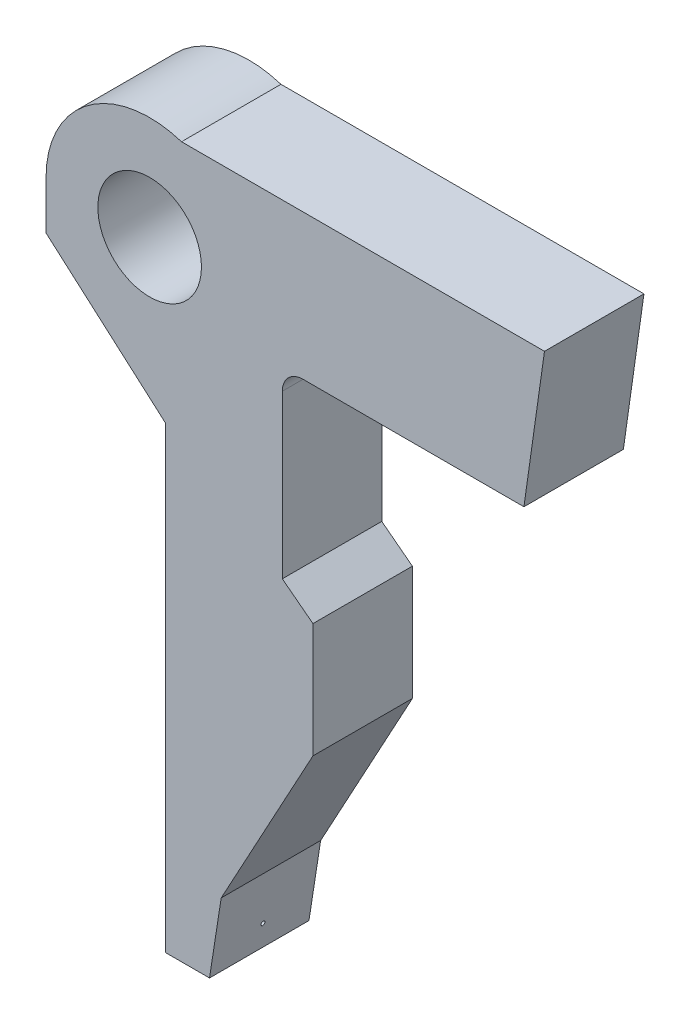
ISO-10303-21;
HEADER;
FILE_DESCRIPTION(('STEP AP214'),'2;1');
FILE_NAME('part.step','',(''),(''),'','','');
FILE_SCHEMA(('AUTOMOTIVE_DESIGN { 1 0 10303 214 1 1 1 1 }'));
ENDSEC;
DATA;
#1=APPLICATION_CONTEXT('core data for automotive mechanical design processes');
#2=APPLICATION_PROTOCOL_DEFINITION('international standard','automotive_design',2000,#1);
#3=PRODUCT_CONTEXT('',#1,'mechanical');
#4=PRODUCT('Part','Part','',(#3));
#5=PRODUCT_RELATED_PRODUCT_CATEGORY('part','',(#4));
#6=PRODUCT_DEFINITION_FORMATION('','',#4);
#7=PRODUCT_DEFINITION_CONTEXT('part definition',#1,'design');
#8=PRODUCT_DEFINITION('design','',#6,#7);
#9=PRODUCT_DEFINITION_SHAPE('','',#8);
#10=(LENGTH_UNIT() NAMED_UNIT(*) SI_UNIT(.MILLI.,.METRE.));
#11=(NAMED_UNIT(*) PLANE_ANGLE_UNIT() SI_UNIT($,.RADIAN.));
#12=(NAMED_UNIT(*) SI_UNIT($,.STERADIAN.) SOLID_ANGLE_UNIT());
#13=UNCERTAINTY_MEASURE_WITH_UNIT(LENGTH_MEASURE(1.E-05),#10,'distance_accuracy_value','');
#14=(GEOMETRIC_REPRESENTATION_CONTEXT(3) GLOBAL_UNCERTAINTY_ASSIGNED_CONTEXT((#13)) GLOBAL_UNIT_ASSIGNED_CONTEXT((#10,
#11,#12)) REPRESENTATION_CONTEXT('',''));
#15=CARTESIAN_POINT('',(0.,0.,0.));
#16=DIRECTION('',(0.,0.,1.));
#17=DIRECTION('',(1.,0.,0.));
#18=AXIS2_PLACEMENT_3D('',#15,#16,#17);
#19=CARTESIAN_POINT('',(6.40208237027269,0.,4.8));
#20=DIRECTION('',(-1.,0.,0.));
#21=DIRECTION('',(0.,-1.,0.));
#22=AXIS2_PLACEMENT_3D('',#19,#20,#21);
#23=PLANE('',#22);
#24=DIRECTION('',(0.,1.,0.));
#25=VECTOR('',#24,1.);
#26=CARTESIAN_POINT('',(6.40208237027269,0.,0.));
#27=LINE('',#26,#25);
#28=CARTESIAN_POINT('',(6.40208237027269,-11.0792552576076,0.));
#29=VERTEX_POINT('',#28);
#30=CARTESIAN_POINT('',(6.40208237027269,-3.2376102121532,0.));
#31=VERTEX_POINT('',#30);
#32=EDGE_CURVE('E170',#29,#31,#27,.T.);
#33=ORIENTED_EDGE('',*,*,#32,.T.);
#34=DIRECTION('',(0.,0.,-1.));
#35=VECTOR('',#34,1.);
#36=CARTESIAN_POINT('',(6.40208237027269,-3.2376102121532,4.8));
#37=LINE('',#36,#35);
#38=CARTESIAN_POINT('',(6.40208237027269,-3.2376102121532,4.8));
#39=VERTEX_POINT('',#38);
#40=EDGE_CURVE('E11',#39,#31,#37,.T.);
#41=ORIENTED_EDGE('',*,*,#40,.F.);
#42=DIRECTION('',(0.,1.,0.));
#43=VECTOR('',#42,1.);
#44=CARTESIAN_POINT('',(6.40208237027269,0.,4.8));
#45=LINE('',#44,#43);
#46=CARTESIAN_POINT('',(6.40208237027269,-11.0792552576076,4.8));
#47=VERTEX_POINT('',#46);
#48=EDGE_CURVE('E200',#47,#39,#45,.T.);
#49=ORIENTED_EDGE('',*,*,#48,.F.);
#50=DIRECTION('',(0.,0.,-1.));
#51=VECTOR('',#50,1.);
#52=CARTESIAN_POINT('',(6.40208237027269,-11.0792552576076,4.8));
#53=LINE('',#52,#51);
#54=EDGE_CURVE('E169',#47,#29,#53,.T.);
#55=ORIENTED_EDGE('',*,*,#54,.T.);
#56=EDGE_LOOP('',(#33,#41,#49,#55));
#57=FACE_BOUND('',#56,.T.);
#58=ADVANCED_FACE('F34',(#57),#23,.F.);
#59=CARTESIAN_POINT('',(7.40208237027269,-3.2376102121532,4.8));
#60=DIRECTION('',(0.,0.,-1.));
#61=DIRECTION('',(-1.,0.,0.));
#62=AXIS2_PLACEMENT_3D('',#59,#60,#61);
#63=CYLINDRICAL_SURFACE('',#62,0.999999999999999);
#64=CARTESIAN_POINT('',(7.40208237027269,-3.2376102121532,0.));
#65=DIRECTION('',(0.,0.,1.));
#66=DIRECTION('',(1.,0.,0.));
#67=AXIS2_PLACEMENT_3D('',#64,#65,#66);
#68=CIRCLE('',#67,0.999999999999999);
#69=CARTESIAN_POINT('',(7.40208237027269,-2.2376102121532,0.));
#70=VERTEX_POINT('',#69);
#71=EDGE_CURVE('E173',#31,#70,#68,.F.);
#72=ORIENTED_EDGE('',*,*,#71,.T.);
#73=DIRECTION('',(0.,0.,-1.));
#74=VECTOR('',#73,1.);
#75=CARTESIAN_POINT('',(7.40208237027269,-2.2376102121532,4.8));
#76=LINE('',#75,#74);
#77=CARTESIAN_POINT('',(7.40208237027269,-2.2376102121532,4.8));
#78=VERTEX_POINT('',#77);
#79=EDGE_CURVE('E42',#78,#70,#76,.T.);
#80=ORIENTED_EDGE('',*,*,#79,.F.);
#81=CARTESIAN_POINT('',(7.40208237027269,-3.2376102121532,4.8));
#82=DIRECTION('',(0.,0.,1.));
#83=DIRECTION('',(1.,0.,0.));
#84=AXIS2_PLACEMENT_3D('',#81,#82,#83);
#85=CIRCLE('',#84,0.999999999999999);
#86=EDGE_CURVE('E111',#39,#78,#85,.F.);
#87=ORIENTED_EDGE('',*,*,#86,.F.);
#88=ORIENTED_EDGE('',*,*,#40,.T.);
#89=EDGE_LOOP('',(#72,#80,#87,#88));
#90=FACE_BOUND('',#89,.T.);
#91=ADVANCED_FACE('F290',(#90),#63,.F.);
#92=CARTESIAN_POINT('',(0.,-2.2376102121532,4.8));
#93=DIRECTION('',(0.,1.,0.));
#94=DIRECTION('',(-1.,0.,0.));
#95=AXIS2_PLACEMENT_3D('',#92,#93,#94);
#96=PLANE('',#95);
#97=DIRECTION('',(1.,0.,0.));
#98=VECTOR('',#97,1.);
#99=CARTESIAN_POINT('',(0.,-2.2376102121532,0.));
#100=LINE('',#99,#98);
#101=CARTESIAN_POINT('',(18.063612226188,-2.2376102121532,0.));
#102=VERTEX_POINT('',#101);
#103=EDGE_CURVE('E176',#70,#102,#100,.T.);
#104=ORIENTED_EDGE('',*,*,#103,.T.);
#105=DIRECTION('',(0.,0.,-1.));
#106=VECTOR('',#105,1.);
#107=CARTESIAN_POINT('',(18.063612226188,-2.2376102121532,4.8));
#108=LINE('',#107,#106);
#109=CARTESIAN_POINT('',(18.063612226188,-2.2376102121532,4.8));
#110=VERTEX_POINT('',#109);
#111=EDGE_CURVE('E225',#110,#102,#108,.T.);
#112=ORIENTED_EDGE('',*,*,#111,.F.);
#113=DIRECTION('',(1.,0.,0.));
#114=VECTOR('',#113,1.);
#115=CARTESIAN_POINT('',(0.,-2.2376102121532,4.8));
#116=LINE('',#115,#114);
#117=EDGE_CURVE('E233',#78,#110,#116,.T.);
#118=ORIENTED_EDGE('',*,*,#117,.F.);
#119=ORIENTED_EDGE('',*,*,#79,.T.);
#120=EDGE_LOOP('',(#104,#112,#118,#119));
#121=FACE_BOUND('',#120,.T.);
#122=ADVANCED_FACE('F231',(#121),#96,.F.);
#123=CARTESIAN_POINT('',(18.0184346235268,-2.55607840833381,4.8));
#124=DIRECTION('',(-0.990087364863809,0.140452874434947,0.));
#125=DIRECTION('',(-0.140452874434947,-0.990087364863809,0.));
#126=AXIS2_PLACEMENT_3D('',#123,#124,#125);
#127=PLANE('',#126);
#128=DIRECTION('',(0.140452874434947,0.990087364863809,0.));
#129=VECTOR('',#128,1.);
#130=CARTESIAN_POINT('',(18.0184346235268,-2.55607840833381,0.));
#131=LINE('',#130,#129);
#132=CARTESIAN_POINT('',(19.0560025989645,4.7579971974597,0.));
#133=VERTEX_POINT('',#132);
#134=EDGE_CURVE('E178',#102,#133,#131,.T.);
#135=ORIENTED_EDGE('',*,*,#134,.T.);
#136=DIRECTION('',(0.,0.,-1.));
#137=VECTOR('',#136,1.);
#138=CARTESIAN_POINT('',(19.0560025989645,4.7579971974597,4.8));
#139=LINE('',#138,#137);
#140=CARTESIAN_POINT('',(19.0560025989645,4.7579971974597,4.8));
#141=VERTEX_POINT('',#140);
#142=EDGE_CURVE('E222',#141,#133,#139,.T.);
#143=ORIENTED_EDGE('',*,*,#142,.F.);
#144=DIRECTION('',(0.140452874434947,0.990087364863809,0.));
#145=VECTOR('',#144,1.);
#146=CARTESIAN_POINT('',(18.0184346235268,-2.55607840833381,4.8));
#147=LINE('',#146,#145);
#148=EDGE_CURVE('E252',#110,#141,#147,.T.);
#149=ORIENTED_EDGE('',*,*,#148,.F.);
#150=ORIENTED_EDGE('',*,*,#111,.T.);
#151=EDGE_LOOP('',(#135,#143,#149,#150));
#152=FACE_BOUND('',#151,.T.);
#153=ADVANCED_FACE('F243',(#152),#127,.F.);
#154=CARTESIAN_POINT('',(0.,4.7579971974597,4.8));
#155=DIRECTION('',(0.,-1.,0.));
#156=DIRECTION('',(0.,0.,-1.));
#157=AXIS2_PLACEMENT_3D('',#154,#155,#156);
#158=PLANE('',#157);
#159=DIRECTION('',(-1.,0.,0.));
#160=VECTOR('',#159,1.);
#161=CARTESIAN_POINT('',(0.,4.7579971974597,0.));
#162=LINE('',#161,#160);
#163=CARTESIAN_POINT('',(1.53670513403374,4.7579971974597,0.));
#164=VERTEX_POINT('',#163);
#165=EDGE_CURVE('E180',#133,#164,#162,.T.);
#166=ORIENTED_EDGE('',*,*,#165,.T.);
#167=DIRECTION('',(0.,0.,-1.));
#168=VECTOR('',#167,1.);
#169=CARTESIAN_POINT('',(1.53670513403374,4.7579971974597,4.8));
#170=LINE('',#169,#168);
#171=CARTESIAN_POINT('',(1.53670513403374,4.7579971974597,4.8));
#172=VERTEX_POINT('',#171);
#173=EDGE_CURVE('E219',#172,#164,#170,.T.);
#174=ORIENTED_EDGE('',*,*,#173,.F.);
#175=DIRECTION('',(-1.,0.,0.));
#176=VECTOR('',#175,1.);
#177=CARTESIAN_POINT('',(0.,4.7579971974597,4.8));
#178=LINE('',#177,#176);
#179=EDGE_CURVE('E249',#141,#172,#178,.T.);
#180=ORIENTED_EDGE('',*,*,#179,.F.);
#181=ORIENTED_EDGE('',*,*,#142,.T.);
#182=EDGE_LOOP('',(#166,#174,#180,#181));
#183=FACE_BOUND('',#182,.T.);
#184=ADVANCED_FACE('F247',(#183),#158,.F.);
#185=CARTESIAN_POINT('',(0.,0.,4.8));
#186=DIRECTION('',(0.,0.,-1.));
#187=DIRECTION('',(-1.,0.,0.));
#188=AXIS2_PLACEMENT_3D('',#185,#186,#187);
#189=CYLINDRICAL_SURFACE('',#188,5.);
#190=CARTESIAN_POINT('',(0.,0.,0.));
#191=DIRECTION('',(0.,0.,1.));
#192=DIRECTION('',(1.,0.,0.));
#193=AXIS2_PLACEMENT_3D('',#190,#191,#192);
#194=CIRCLE('',#193,5.);
#195=CARTESIAN_POINT('',(-5.,0.,0.));
#196=VERTEX_POINT('',#195);
#197=EDGE_CURVE('E182',#164,#196,#194,.T.);
#198=ORIENTED_EDGE('',*,*,#197,.T.);
#199=DIRECTION('',(0.,0.,-1.));
#200=VECTOR('',#199,1.);
#201=CARTESIAN_POINT('',(-5.,0.,4.8));
#202=LINE('',#201,#200);
#203=CARTESIAN_POINT('',(-5.,0.,4.8));
#204=VERTEX_POINT('',#203);
#205=EDGE_CURVE('E216',#204,#196,#202,.T.);
#206=ORIENTED_EDGE('',*,*,#205,.F.);
#207=CARTESIAN_POINT('',(0.,0.,4.8));
#208=DIRECTION('',(0.,0.,1.));
#209=DIRECTION('',(1.,0.,0.));
#210=AXIS2_PLACEMENT_3D('',#207,#208,#209);
#211=CIRCLE('',#210,5.);
#212=EDGE_CURVE('E251',#172,#204,#211,.T.);
#213=ORIENTED_EDGE('',*,*,#212,.F.);
#214=ORIENTED_EDGE('',*,*,#173,.T.);
#215=EDGE_LOOP('',(#198,#206,#213,#214));
#216=FACE_BOUND('',#215,.T.);
#217=ADVANCED_FACE('F303',(#216),#189,.T.);
#218=CARTESIAN_POINT('',(-5.,0.,4.8));
#219=DIRECTION('',(1.,0.,0.));
#220=DIRECTION('',(0.,0.,-1.));
#221=AXIS2_PLACEMENT_3D('',#218,#219,#220);
#222=PLANE('',#221);
#223=DIRECTION('',(0.,-1.,0.));
#224=VECTOR('',#223,1.);
#225=CARTESIAN_POINT('',(-5.,0.,0.));
#226=LINE('',#225,#224);
#227=CARTESIAN_POINT('',(-5.,-2.32647439688253,0.));
#228=VERTEX_POINT('',#227);
#229=EDGE_CURVE('E184',#196,#228,#226,.T.);
#230=ORIENTED_EDGE('',*,*,#229,.T.);
#231=DIRECTION('',(0.,0.,-1.));
#232=VECTOR('',#231,1.);
#233=CARTESIAN_POINT('',(-5.,-2.32647439688253,4.8));
#234=LINE('',#233,#232);
#235=CARTESIAN_POINT('',(-5.,-2.32647439688253,4.8));
#236=VERTEX_POINT('',#235);
#237=EDGE_CURVE('E213',#236,#228,#234,.T.);
#238=ORIENTED_EDGE('',*,*,#237,.F.);
#239=DIRECTION('',(0.,-1.,0.));
#240=VECTOR('',#239,1.);
#241=CARTESIAN_POINT('',(-5.,0.,4.8));
#242=LINE('',#241,#240);
#243=EDGE_CURVE('E254',#204,#236,#242,.T.);
#244=ORIENTED_EDGE('',*,*,#243,.F.);
#245=ORIENTED_EDGE('',*,*,#205,.T.);
#246=EDGE_LOOP('',(#230,#238,#244,#245));
#247=FACE_BOUND('',#246,.T.);
#248=ADVANCED_FACE('F306',(#247),#222,.F.);
#249=CARTESIAN_POINT('',(-3.32960365921922,-3.79285286398016,4.8));
#250=DIRECTION('',(0.659722162079872,0.751509593325767,0.));
#251=DIRECTION('',(-0.751509593325767,0.659722162079872,0.));
#252=AXIS2_PLACEMENT_3D('',#249,#250,#251);
#253=PLANE('',#252);
#254=DIRECTION('',(0.751509593325767,-0.659722162079872,0.));
#255=VECTOR('',#254,1.);
#256=CARTESIAN_POINT('',(-3.32960365921922,-3.79285286398016,0.));
#257=LINE('',#256,#255);
#258=CARTESIAN_POINT('',(0.754164722411706,-7.3778403745722,0.));
#259=VERTEX_POINT('',#258);
#260=EDGE_CURVE('E186',#228,#259,#257,.T.);
#261=ORIENTED_EDGE('',*,*,#260,.T.);
#262=DIRECTION('',(0.,0.,-1.));
#263=VECTOR('',#262,1.);
#264=CARTESIAN_POINT('',(0.754164722411706,-7.3778403745722,4.8));
#265=LINE('',#264,#263);
#266=CARTESIAN_POINT('',(0.754164722411706,-7.3778403745722,4.8));
#267=VERTEX_POINT('',#266);
#268=EDGE_CURVE('E210',#267,#259,#265,.T.);
#269=ORIENTED_EDGE('',*,*,#268,.F.);
#270=DIRECTION('',(0.751509593325767,-0.659722162079872,0.));
#271=VECTOR('',#270,1.);
#272=CARTESIAN_POINT('',(-3.32960365921922,-3.79285286398016,4.8));
#273=LINE('',#272,#271);
#274=EDGE_CURVE('E260',#236,#267,#273,.T.);
#275=ORIENTED_EDGE('',*,*,#274,.F.);
#276=ORIENTED_EDGE('',*,*,#237,.T.);
#277=EDGE_LOOP('',(#261,#269,#275,#276));
#278=FACE_BOUND('',#277,.T.);
#279=ADVANCED_FACE('F310',(#278),#253,.F.);
#280=CARTESIAN_POINT('',(0.754164722411706,0.,4.8));
#281=DIRECTION('',(1.,0.,0.));
#282=DIRECTION('',(0.,0.,-1.));
#283=AXIS2_PLACEMENT_3D('',#280,#281,#282);
#284=PLANE('',#283);
#285=CARTESIAN_POINT('',(0.754164722411706,-27.0198901160511,2.4));
#286=DIRECTION('',(-1.,0.,0.));
#287=DIRECTION('',(0.,0.,1.));
#288=AXIS2_PLACEMENT_3D('',#285,#286,#287);
#289=CIRCLE('',#288,1.825);
#290=CARTESIAN_POINT('',(0.754164722411706,-27.0198901160511,4.225));
#291=VERTEX_POINT('',#290);
#292=EDGE_CURVE('E415',#291,#291,#289,.T.);
#293=ORIENTED_EDGE('',*,*,#292,.F.);
#294=EDGE_LOOP('',(#293));
#295=FACE_BOUND('',#294,.T.);
#296=DIRECTION('',(0.,-1.,0.));
#297=VECTOR('',#296,1.);
#298=CARTESIAN_POINT('',(0.754164722411706,0.,0.));
#299=LINE('',#298,#297);
#300=CARTESIAN_POINT('',(0.754164722411706,-29.5198901160511,0.));
#301=VERTEX_POINT('',#300);
#302=EDGE_CURVE('E188',#259,#301,#299,.T.);
#303=ORIENTED_EDGE('',*,*,#302,.T.);
#304=DIRECTION('',(0.,0.,-1.));
#305=VECTOR('',#304,1.);
#306=CARTESIAN_POINT('',(0.754164722411706,-29.5198901160511,4.8));
#307=LINE('',#306,#305);
#308=CARTESIAN_POINT('',(0.754164722411706,-29.5198901160511,4.8));
#309=VERTEX_POINT('',#308);
#310=EDGE_CURVE('E207',#309,#301,#307,.T.);
#311=ORIENTED_EDGE('',*,*,#310,.F.);
#312=DIRECTION('',(0.,-1.,0.));
#313=VECTOR('',#312,1.);
#314=CARTESIAN_POINT('',(0.754164722411706,0.,4.8));
#315=LINE('',#314,#313);
#316=EDGE_CURVE('E262',#267,#309,#315,.T.);
#317=ORIENTED_EDGE('',*,*,#316,.F.);
#318=ORIENTED_EDGE('',*,*,#268,.T.);
#319=EDGE_LOOP('',(#303,#311,#317,#318));
#320=FACE_BOUND('',#319,.T.);
#321=ADVANCED_FACE('F314',(#295,#320),#284,.F.);
#322=CARTESIAN_POINT('',(-2.39866646747301E-13,-29.519890116051,4.8));
#323=DIRECTION('',(0.,1.,0.));
#324=DIRECTION('',(-1.,0.,0.));
#325=AXIS2_PLACEMENT_3D('',#322,#323,#324);
#326=PLANE('',#325);
#327=DIRECTION('',(1.,0.,0.));
#328=VECTOR('',#327,1.);
#329=CARTESIAN_POINT('',(-2.39866646747301E-13,-29.519890116051,0.));
#330=LINE('',#329,#328);
#331=CARTESIAN_POINT('',(2.88905288160283,-29.5198901160511,0.));
#332=VERTEX_POINT('',#331);
#333=EDGE_CURVE('E190',#301,#332,#330,.T.);
#334=ORIENTED_EDGE('',*,*,#333,.T.);
#335=DIRECTION('',(0.,0.,-1.));
#336=VECTOR('',#335,1.);
#337=CARTESIAN_POINT('',(2.88905288160283,-29.5198901160511,4.8));
#338=LINE('',#337,#336);
#339=CARTESIAN_POINT('',(2.88905288160283,-29.5198901160511,4.8));
#340=VERTEX_POINT('',#339);
#341=EDGE_CURVE('E204',#340,#332,#338,.T.);
#342=ORIENTED_EDGE('',*,*,#341,.F.);
#343=DIRECTION('',(1.,0.,0.));
#344=VECTOR('',#343,1.);
#345=CARTESIAN_POINT('',(-2.39866646747301E-13,-29.519890116051,4.8));
#346=LINE('',#345,#344);
#347=EDGE_CURVE('E264',#309,#340,#346,.T.);
#348=ORIENTED_EDGE('',*,*,#347,.F.);
#349=ORIENTED_EDGE('',*,*,#310,.T.);
#350=EDGE_LOOP('',(#334,#342,#348,#349));
#351=FACE_BOUND('',#350,.T.);
#352=ADVANCED_FACE('F270',(#351),#326,.F.);
#353=CARTESIAN_POINT('',(7.29737212162931,-1.13324948681235,4.8));
#354=DIRECTION('',(-0.988155457698499,0.153456154717463,0.));
#355=DIRECTION('',(-0.153456154717463,-0.988155457698499,0.));
#356=AXIS2_PLACEMENT_3D('',#353,#354,#355);
#357=PLANE('',#356);
#358=CARTESIAN_POINT('',(3.07152516406432,-28.3448901160511,2.4));
#359=DIRECTION('',(-0.988155457698499,0.153456154717463,0.));
#360=DIRECTION('',(-0.153456154717463,-0.988155457698499,0.));
#361=AXIS2_PLACEMENT_3D('',#358,#359,#360);
#362=ELLIPSE('',#361,0.101198651711046,0.0999999999999997);
#363=CARTESIAN_POINT('',(3.05599560811015,-28.4448901160511,2.4));
#364=VERTEX_POINT('',#363);
#365=EDGE_CURVE('E414',#364,#364,#362,.F.);
#366=ORIENTED_EDGE('',*,*,#365,.F.);
#367=EDGE_LOOP('',(#366));
#368=FACE_BOUND('',#367,.T.);
#369=DIRECTION('',(0.153456154717463,0.988155457698499,0.));
#370=VECTOR('',#369,1.);
#371=CARTESIAN_POINT('',(7.29737212162931,-1.13324948681235,0.));
#372=LINE('',#371,#370);
#373=CARTESIAN_POINT('',(3.45262694445621,-25.8908484067027,0.));
#374=VERTEX_POINT('',#373);
#375=EDGE_CURVE('E192',#332,#374,#372,.T.);
#376=ORIENTED_EDGE('',*,*,#375,.T.);
#377=DIRECTION('',(0.,0.,-1.));
#378=VECTOR('',#377,1.);
#379=CARTESIAN_POINT('',(3.45262694445621,-25.8908484067027,4.8));
#380=LINE('',#379,#378);
#381=CARTESIAN_POINT('',(3.45262694445621,-25.8908484067027,4.8));
#382=VERTEX_POINT('',#381);
#383=EDGE_CURVE('E158',#382,#374,#380,.T.);
#384=ORIENTED_EDGE('',*,*,#383,.F.);
#385=DIRECTION('',(0.153456154717463,0.988155457698499,0.));
#386=VECTOR('',#385,1.);
#387=CARTESIAN_POINT('',(7.29737212162931,-1.13324948681235,4.8));
#388=LINE('',#387,#386);
#389=EDGE_CURVE('E149',#340,#382,#388,.T.);
#390=ORIENTED_EDGE('',*,*,#389,.F.);
#391=ORIENTED_EDGE('',*,*,#341,.T.);
#392=EDGE_LOOP('',(#376,#384,#390,#391));
#393=FACE_BOUND('',#392,.T.);
#394=ADVANCED_FACE('F274',(#368,#393),#357,.F.);
#395=CARTESIAN_POINT('',(13.5263332156528,-7.34866620752027,4.8));
#396=DIRECTION('',(-0.878695413301182,0.477382834466704,0.));
#397=DIRECTION('',(-0.477382834466704,-0.878695413301182,0.));
#398=AXIS2_PLACEMENT_3D('',#395,#396,#397);
#399=PLANE('',#398);
#400=DIRECTION('',(0.477382834466704,0.878695413301182,0.));
#401=VECTOR('',#400,1.);
#402=CARTESIAN_POINT('',(13.5263332156528,-7.34866620752027,0.));
#403=LINE('',#402,#401);
#404=CARTESIAN_POINT('',(7.88035743742888,-17.7409397912093,0.));
#405=VERTEX_POINT('',#404);
#406=EDGE_CURVE('E157',#374,#405,#403,.T.);
#407=ORIENTED_EDGE('',*,*,#406,.T.);
#408=DIRECTION('',(0.,0.,-1.));
#409=VECTOR('',#408,1.);
#410=CARTESIAN_POINT('',(7.88035743742888,-17.7409397912093,4.8));
#411=LINE('',#410,#409);
#412=CARTESIAN_POINT('',(7.88035743742888,-17.7409397912093,4.8));
#413=VERTEX_POINT('',#412);
#414=EDGE_CURVE('E154',#413,#405,#411,.T.);
#415=ORIENTED_EDGE('',*,*,#414,.F.);
#416=DIRECTION('',(0.477382834466704,0.878695413301182,0.));
#417=VECTOR('',#416,1.);
#418=CARTESIAN_POINT('',(13.5263332156528,-7.34866620752027,4.8));
#419=LINE('',#418,#417);
#420=EDGE_CURVE('E142',#382,#413,#419,.T.);
#421=ORIENTED_EDGE('',*,*,#420,.F.);
#422=ORIENTED_EDGE('',*,*,#383,.T.);
#423=EDGE_LOOP('',(#407,#415,#421,#422));
#424=FACE_BOUND('',#423,.T.);
#425=ADVANCED_FACE('F155',(#424),#399,.F.);
#426=CARTESIAN_POINT('',(7.88035743742888,0.,4.8));
#427=DIRECTION('',(-1.,0.,0.));
#428=DIRECTION('',(0.,0.,1.));
#429=AXIS2_PLACEMENT_3D('',#426,#427,#428);
#430=PLANE('',#429);
#431=DIRECTION('',(0.,1.,0.));
#432=VECTOR('',#431,1.);
#433=CARTESIAN_POINT('',(7.88035743742888,0.,0.));
#434=LINE('',#433,#432);
#435=CARTESIAN_POINT('',(7.88035743742888,-12.211059605899,0.));
#436=VERTEX_POINT('',#435);
#437=EDGE_CURVE('E97',#405,#436,#434,.T.);
#438=ORIENTED_EDGE('',*,*,#437,.T.);
#439=DIRECTION('',(0.,0.,-1.));
#440=VECTOR('',#439,1.);
#441=CARTESIAN_POINT('',(7.88035743742888,-12.211059605899,4.8));
#442=LINE('',#441,#440);
#443=CARTESIAN_POINT('',(7.88035743742888,-12.211059605899,4.8));
#444=VERTEX_POINT('',#443);
#445=EDGE_CURVE('E159',#444,#436,#442,.T.);
#446=ORIENTED_EDGE('',*,*,#445,.F.);
#447=DIRECTION('',(0.,1.,0.));
#448=VECTOR('',#447,1.);
#449=CARTESIAN_POINT('',(7.88035743742888,0.,4.8));
#450=LINE('',#449,#448);
#451=EDGE_CURVE('E147',#413,#444,#450,.T.);
#452=ORIENTED_EDGE('',*,*,#451,.F.);
#453=ORIENTED_EDGE('',*,*,#414,.T.);
#454=EDGE_LOOP('',(#438,#446,#452,#453));
#455=FACE_BOUND('',#454,.T.);
#456=ADVANCED_FACE('F161',(#455),#430,.F.);
#457=CARTESIAN_POINT('',(-2.98186004568765,-3.89467434538796,4.8));
#458=DIRECTION('',(-0.607910502716912,-0.794005554569029,0.));
#459=DIRECTION('',(0.794005554569029,-0.607910502716912,0.));
#460=AXIS2_PLACEMENT_3D('',#457,#458,#459);
#461=PLANE('',#460);
#462=DIRECTION('',(-0.794005554569029,0.607910502716912,0.));
#463=VECTOR('',#462,1.);
#464=CARTESIAN_POINT('',(-2.98186004568765,-3.89467434538796,0.));
#465=LINE('',#464,#463);
#466=EDGE_CURVE('E103',#436,#29,#465,.T.);
#467=ORIENTED_EDGE('',*,*,#466,.T.);
#468=ORIENTED_EDGE('',*,*,#54,.F.);
#469=DIRECTION('',(-0.794005554569029,0.607910502716912,0.));
#470=VECTOR('',#469,1.);
#471=CARTESIAN_POINT('',(-2.98186004568765,-3.89467434538796,4.8));
#472=LINE('',#471,#470);
#473=EDGE_CURVE('E50',#444,#47,#472,.T.);
#474=ORIENTED_EDGE('',*,*,#473,.F.);
#475=ORIENTED_EDGE('',*,*,#445,.T.);
#476=EDGE_LOOP('',(#467,#468,#474,#475));
#477=FACE_BOUND('',#476,.T.);
#478=ADVANCED_FACE('F278',(#477),#461,.F.);
#479=CARTESIAN_POINT('',(0.,0.,4.8));
#480=DIRECTION('',(0.,0.,-1.));
#481=DIRECTION('',(-1.,0.,0.));
#482=AXIS2_PLACEMENT_3D('',#479,#480,#481);
#483=CYLINDRICAL_SURFACE('',#482,2.5);
#484=CARTESIAN_POINT('',(0.,0.,4.8));
#485=DIRECTION('',(0.,0.,1.));
#486=DIRECTION('',(1.,0.,0.));
#487=AXIS2_PLACEMENT_3D('',#484,#485,#486);
#488=CIRCLE('',#487,2.5);
#489=CARTESIAN_POINT('',(2.5,0.,4.8));
#490=VERTEX_POINT('',#489);
#491=EDGE_CURVE('E163',#490,#490,#488,.T.);
#492=ORIENTED_EDGE('',*,*,#491,.T.);
#493=EDGE_LOOP('',(#492));
#494=FACE_BOUND('',#493,.T.);
#495=CARTESIAN_POINT('',(0.,0.,0.));
#496=DIRECTION('',(0.,0.,1.));
#497=DIRECTION('',(1.,0.,0.));
#498=AXIS2_PLACEMENT_3D('',#495,#496,#497);
#499=CIRCLE('',#498,2.5);
#500=CARTESIAN_POINT('',(2.5,0.,0.));
#501=VERTEX_POINT('',#500);
#502=EDGE_CURVE('E197',#501,#501,#499,.T.);
#503=ORIENTED_EDGE('',*,*,#502,.F.);
#504=EDGE_LOOP('',(#503));
#505=FACE_BOUND('',#504,.T.);
#506=ADVANCED_FACE('F280',(#494,#505),#483,.F.);
#507=CARTESIAN_POINT('',(0.,0.,4.8));
#508=DIRECTION('',(0.,0.,1.));
#509=DIRECTION('',(1.,0.,0.));
#510=AXIS2_PLACEMENT_3D('',#507,#508,#509);
#511=PLANE('',#510);
#512=ORIENTED_EDGE('',*,*,#48,.T.);
#513=ORIENTED_EDGE('',*,*,#86,.T.);
#514=ORIENTED_EDGE('',*,*,#117,.T.);
#515=ORIENTED_EDGE('',*,*,#148,.T.);
#516=ORIENTED_EDGE('',*,*,#179,.T.);
#517=ORIENTED_EDGE('',*,*,#212,.T.);
#518=ORIENTED_EDGE('',*,*,#243,.T.);
#519=ORIENTED_EDGE('',*,*,#274,.T.);
#520=ORIENTED_EDGE('',*,*,#316,.T.);
#521=ORIENTED_EDGE('',*,*,#347,.T.);
#522=ORIENTED_EDGE('',*,*,#389,.T.);
#523=ORIENTED_EDGE('',*,*,#420,.T.);
#524=ORIENTED_EDGE('',*,*,#451,.T.);
#525=ORIENTED_EDGE('',*,*,#473,.T.);
#526=EDGE_LOOP('',(#512,#513,#514,#515,#516,#517,#518,#519,#520,#521,#522,#523,#524,#525));
#527=FACE_BOUND('',#526,.T.);
#528=ORIENTED_EDGE('',*,*,#491,.F.);
#529=EDGE_LOOP('',(#528));
#530=FACE_BOUND('',#529,.T.);
#531=ADVANCED_FACE('F144',(#527,#530),#511,.T.);
#532=CARTESIAN_POINT('',(0.,0.,0.));
#533=DIRECTION('',(0.,0.,1.));
#534=DIRECTION('',(1.,0.,0.));
#535=AXIS2_PLACEMENT_3D('',#532,#533,#534);
#536=PLANE('',#535);
#537=ORIENTED_EDGE('',*,*,#32,.F.);
#538=ORIENTED_EDGE('',*,*,#466,.F.);
#539=ORIENTED_EDGE('',*,*,#437,.F.);
#540=ORIENTED_EDGE('',*,*,#406,.F.);
#541=ORIENTED_EDGE('',*,*,#375,.F.);
#542=ORIENTED_EDGE('',*,*,#333,.F.);
#543=ORIENTED_EDGE('',*,*,#302,.F.);
#544=ORIENTED_EDGE('',*,*,#260,.F.);
#545=ORIENTED_EDGE('',*,*,#229,.F.);
#546=ORIENTED_EDGE('',*,*,#197,.F.);
#547=ORIENTED_EDGE('',*,*,#165,.F.);
#548=ORIENTED_EDGE('',*,*,#134,.F.);
#549=ORIENTED_EDGE('',*,*,#103,.F.);
#550=ORIENTED_EDGE('',*,*,#71,.F.);
#551=EDGE_LOOP('',(#537,#538,#539,#540,#541,#542,#543,#544,#545,#546,#547,#548,#549,#550));
#552=FACE_BOUND('',#551,.T.);
#553=ORIENTED_EDGE('',*,*,#502,.T.);
#554=EDGE_LOOP('',(#553));
#555=FACE_BOUND('',#554,.T.);
#556=ADVANCED_FACE('F237',(#552,#555),#536,.F.);
#557=CARTESIAN_POINT('',(2.55416472241171,-27.0198901160511,2.4));
#558=DIRECTION('',(-1.,0.,0.));
#559=DIRECTION('',(0.,0.,1.));
#560=AXIS2_PLACEMENT_3D('',#557,#558,#559);
#561=CYLINDRICAL_SURFACE('',#560,1.825);
#562=CARTESIAN_POINT('',(2.55416472241171,-27.0198901160511,2.4));
#563=DIRECTION('',(-1.,0.,0.));
#564=DIRECTION('',(0.,0.,1.));
#565=AXIS2_PLACEMENT_3D('',#562,#563,#564);
#566=CIRCLE('',#565,1.825);
#567=CARTESIAN_POINT('',(2.55416472241171,-27.0198901160511,4.225));
#568=VERTEX_POINT('',#567);
#569=EDGE_CURVE('E174',#568,#568,#566,.T.);
#570=ORIENTED_EDGE('',*,*,#569,.F.);
#571=EDGE_LOOP('',(#570));
#572=FACE_BOUND('',#571,.T.);
#573=ORIENTED_EDGE('',*,*,#292,.T.);
#574=EDGE_LOOP('',(#573));
#575=FACE_BOUND('',#574,.T.);
#576=ADVANCED_FACE('F363',(#572,#575),#561,.F.);
#577=CARTESIAN_POINT('',(2.55416472241171,-27.0198901160511,2.4));
#578=DIRECTION('',(-1.,0.,0.));
#579=DIRECTION('',(0.,0.,1.));
#580=AXIS2_PLACEMENT_3D('',#577,#578,#579);
#581=PLANE('',#580);
#582=CARTESIAN_POINT('',(2.55416472241171,-28.3448901160511,2.4));
#583=DIRECTION('',(-1.,0.,0.));
#584=DIRECTION('',(0.,0.,1.));
#585=AXIS2_PLACEMENT_3D('',#582,#583,#584);
#586=CIRCLE('',#585,0.0999999999999997);
#587=CARTESIAN_POINT('',(2.55416472241171,-28.3448901160511,2.5));
#588=VERTEX_POINT('',#587);
#589=EDGE_CURVE('E411',#588,#588,#586,.T.);
#590=ORIENTED_EDGE('',*,*,#589,.F.);
#591=EDGE_LOOP('',(#590));
#592=FACE_BOUND('',#591,.T.);
#593=ORIENTED_EDGE('',*,*,#569,.T.);
#594=EDGE_LOOP('',(#593));
#595=FACE_BOUND('',#594,.T.);
#596=ADVANCED_FACE('F379',(#592,#595),#581,.T.);
#597=CARTESIAN_POINT('',(19.0570025989645,-28.3448901160511,2.4));
#598=DIRECTION('',(-1.,0.,0.));
#599=DIRECTION('',(0.,0.,1.));
#600=AXIS2_PLACEMENT_3D('',#597,#598,#599);
#601=CYLINDRICAL_SURFACE('',#600,0.0999999999999997);
#602=ORIENTED_EDGE('',*,*,#589,.T.);
#603=EDGE_LOOP('',(#602));
#604=FACE_BOUND('',#603,.T.);
#605=ORIENTED_EDGE('',*,*,#365,.T.);
#606=EDGE_LOOP('',(#605));
#607=FACE_BOUND('',#606,.T.);
#608=ADVANCED_FACE('F394',(#604,#607),#601,.F.);
#609=CLOSED_SHELL('',(#58,#91,#122,#153,#184,#217,#248,#279,#321,#352,#394,#425,#456,#478,#506,
#531,#556,#576,#596,#608));
#610=MANIFOLD_SOLID_BREP('B2',#609);
#611=ADVANCED_BREP_SHAPE_REPRESENTATION('',(#18,#610),#14);
#612=SHAPE_DEFINITION_REPRESENTATION(#9,#611);
ENDSEC;
END-ISO-10303-21;
